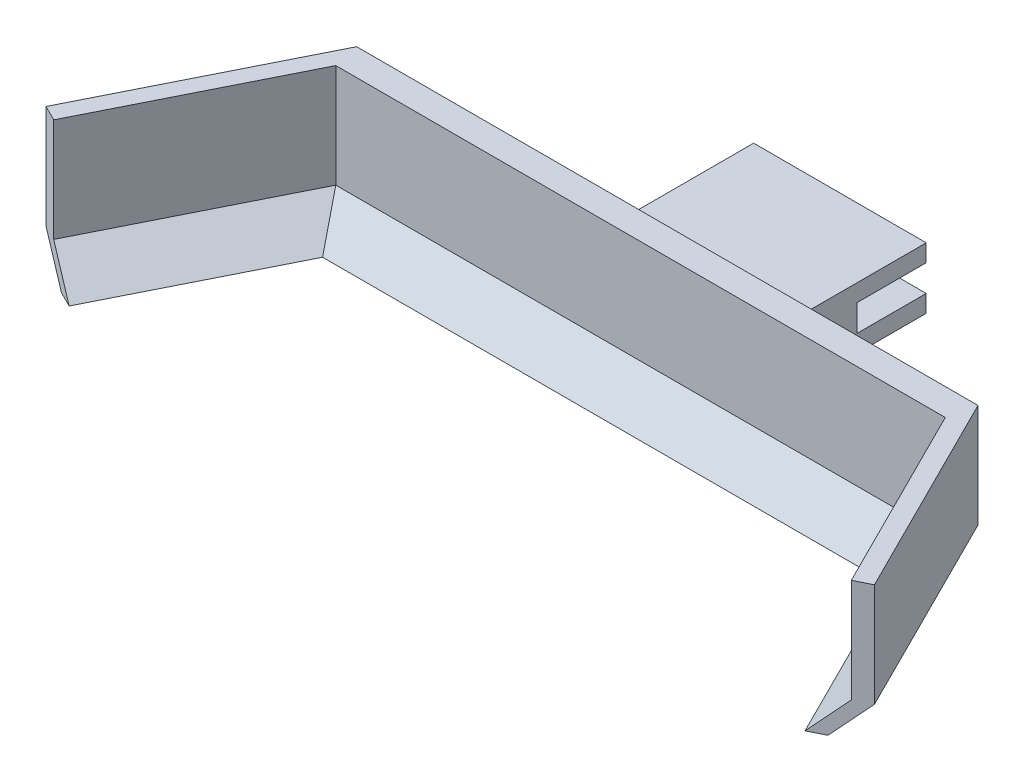
ISO-10303-21;
HEADER;
FILE_DESCRIPTION(('STEP AP214'),'2;1');
FILE_NAME('part.step','',(''),(''),'','','');
FILE_SCHEMA(('AUTOMOTIVE_DESIGN { 1 0 10303 214 1 1 1 1 }'));
ENDSEC;
DATA;
#1=APPLICATION_CONTEXT('core data for automotive mechanical design processes');
#2=APPLICATION_PROTOCOL_DEFINITION('international standard','automotive_design',2000,#1);
#3=PRODUCT_CONTEXT('',#1,'mechanical');
#4=PRODUCT('Part','Part','',(#3));
#5=PRODUCT_RELATED_PRODUCT_CATEGORY('part','',(#4));
#6=PRODUCT_DEFINITION_FORMATION('','',#4);
#7=PRODUCT_DEFINITION_CONTEXT('part definition',#1,'design');
#8=PRODUCT_DEFINITION('design','',#6,#7);
#9=PRODUCT_DEFINITION_SHAPE('','',#8);
#10=(LENGTH_UNIT() NAMED_UNIT(*) SI_UNIT(.MILLI.,.METRE.));
#11=(NAMED_UNIT(*) PLANE_ANGLE_UNIT() SI_UNIT($,.RADIAN.));
#12=(NAMED_UNIT(*) SI_UNIT($,.STERADIAN.) SOLID_ANGLE_UNIT());
#13=UNCERTAINTY_MEASURE_WITH_UNIT(LENGTH_MEASURE(1.E-05),#10,'distance_accuracy_value','');
#14=(GEOMETRIC_REPRESENTATION_CONTEXT(3) GLOBAL_UNCERTAINTY_ASSIGNED_CONTEXT((#13)) GLOBAL_UNIT_ASSIGNED_CONTEXT((#10,
#11,#12)) REPRESENTATION_CONTEXT('',''));
#15=CARTESIAN_POINT('',(0.,0.,0.));
#16=DIRECTION('',(0.,0.,1.));
#17=DIRECTION('',(1.,0.,0.));
#18=AXIS2_PLACEMENT_3D('',#15,#16,#17);
#19=CARTESIAN_POINT('',(0.,0.,-55.));
#20=DIRECTION('',(0.,0.,1.));
#21=DIRECTION('',(1.,0.,0.));
#22=AXIS2_PLACEMENT_3D('',#19,#20,#21);
#23=PLANE('',#22);
#24=DIRECTION('',(0.,-1.,0.));
#25=VECTOR('',#24,1.);
#26=CARTESIAN_POINT('',(25.,5.6,-55.));
#27=LINE('',#26,#25);
#28=CARTESIAN_POINT('',(25.,23.3,-55.));
#29=VERTEX_POINT('',#28);
#30=CARTESIAN_POINT('',(25.,18.3,-55.));
#31=VERTEX_POINT('',#30);
#32=EDGE_CURVE('E238',#29,#31,#27,.T.);
#33=ORIENTED_EDGE('',*,*,#32,.T.);
#34=DIRECTION('',(1.,0.,0.));
#35=VECTOR('',#34,1.);
#36=CARTESIAN_POINT('',(25.,18.3,-55.));
#37=LINE('',#36,#35);
#38=CARTESIAN_POINT('',(-25.,18.3,-55.));
#39=VERTEX_POINT('',#38);
#40=EDGE_CURVE('E216',#39,#31,#37,.T.);
#41=ORIENTED_EDGE('',*,*,#40,.F.);
#42=DIRECTION('',(0.,1.,0.));
#43=VECTOR('',#42,1.);
#44=CARTESIAN_POINT('',(-25.,5.6,-55.));
#45=LINE('',#44,#43);
#46=CARTESIAN_POINT('',(-25.,23.3,-55.));
#47=VERTEX_POINT('',#46);
#48=EDGE_CURVE('E235',#39,#47,#45,.T.);
#49=ORIENTED_EDGE('',*,*,#48,.T.);
#50=DIRECTION('',(1.,0.,0.));
#51=VECTOR('',#50,1.);
#52=CARTESIAN_POINT('',(25.,23.3,-55.));
#53=LINE('',#52,#51);
#54=EDGE_CURVE('E234',#47,#29,#53,.T.);
#55=ORIENTED_EDGE('',*,*,#54,.T.);
#56=EDGE_LOOP('',(#33,#41,#49,#55));
#57=FACE_BOUND('',#56,.T.);
#58=ADVANCED_FACE('F47',(#57),#23,.F.);
#59=CARTESIAN_POINT('',(-90.,10.,-5.));
#60=DIRECTION('',(0.,0.,1.));
#61=DIRECTION('',(1.,0.,0.));
#62=AXIS2_PLACEMENT_3D('',#59,#60,#61);
#63=PLANE('',#62);
#64=DIRECTION('',(0.,-1.,0.));
#65=VECTOR('',#64,1.);
#66=CARTESIAN_POINT('',(90.,10.,-5.));
#67=LINE('',#66,#65);
#68=CARTESIAN_POINT('',(90.,40.,-5.));
#69=VERTEX_POINT('',#68);
#70=CARTESIAN_POINT('',(90.,9.99999999999998,-5.));
#71=VERTEX_POINT('',#70);
#72=EDGE_CURVE('E339',#69,#71,#67,.T.);
#73=ORIENTED_EDGE('',*,*,#72,.T.);
#74=DIRECTION('',(-1.,0.,0.));
#75=VECTOR('',#74,1.);
#76=CARTESIAN_POINT('',(-90.,9.99999999999998,-5.));
#77=LINE('',#76,#75);
#78=CARTESIAN_POINT('',(25.,9.99999999999998,-5.));
#79=VERTEX_POINT('',#78);
#80=EDGE_CURVE('E393',#71,#79,#77,.T.);
#81=ORIENTED_EDGE('',*,*,#80,.T.);
#82=DIRECTION('',(0.,-1.,0.));
#83=VECTOR('',#82,1.);
#84=CARTESIAN_POINT('',(25.,5.6,-5.));
#85=LINE('',#84,#83);
#86=CARTESIAN_POINT('',(25.,23.3,-5.));
#87=VERTEX_POINT('',#86);
#88=EDGE_CURVE('E253',#87,#79,#85,.T.);
#89=ORIENTED_EDGE('',*,*,#88,.F.);
#90=DIRECTION('',(1.,0.,0.));
#91=VECTOR('',#90,1.);
#92=CARTESIAN_POINT('',(25.,23.3,-5.));
#93=LINE('',#92,#91);
#94=CARTESIAN_POINT('',(-25.,23.3,-5.));
#95=VERTEX_POINT('',#94);
#96=EDGE_CURVE('E248',#95,#87,#93,.T.);
#97=ORIENTED_EDGE('',*,*,#96,.F.);
#98=DIRECTION('',(0.,1.,0.));
#99=VECTOR('',#98,1.);
#100=CARTESIAN_POINT('',(-25.,5.6,-5.));
#101=LINE('',#100,#99);
#102=CARTESIAN_POINT('',(-25.,9.99999999999998,-5.));
#103=VERTEX_POINT('',#102);
#104=EDGE_CURVE('E245',#103,#95,#101,.T.);
#105=ORIENTED_EDGE('',*,*,#104,.F.);
#106=DIRECTION('',(-1.,0.,0.));
#107=VECTOR('',#106,1.);
#108=CARTESIAN_POINT('',(-90.,9.99999999999998,-5.));
#109=LINE('',#108,#107);
#110=CARTESIAN_POINT('',(-90.,9.99999999999998,-5.));
#111=VERTEX_POINT('',#110);
#112=EDGE_CURVE('E390',#103,#111,#109,.T.);
#113=ORIENTED_EDGE('',*,*,#112,.T.);
#114=DIRECTION('',(0.,-1.,0.));
#115=VECTOR('',#114,1.);
#116=CARTESIAN_POINT('',(-90.,10.,-5.));
#117=LINE('',#116,#115);
#118=CARTESIAN_POINT('',(-90.,40.,-5.));
#119=VERTEX_POINT('',#118);
#120=EDGE_CURVE('E328',#119,#111,#117,.T.);
#121=ORIENTED_EDGE('',*,*,#120,.F.);
#122=DIRECTION('',(-1.,0.,0.));
#123=VECTOR('',#122,1.);
#124=CARTESIAN_POINT('',(-90.,40.,-5.));
#125=LINE('',#124,#123);
#126=EDGE_CURVE('E290',#69,#119,#125,.T.);
#127=ORIENTED_EDGE('',*,*,#126,.F.);
#128=EDGE_LOOP('',(#73,#81,#89,#97,#105,#113,#121,#127));
#129=FACE_BOUND('',#128,.T.);
#130=ADVANCED_FACE('F451',(#129),#63,.F.);
#131=CARTESIAN_POINT('',(-90.,10.,-5.));
#132=DIRECTION('',(0.894427190999916,0.,0.447213595499958));
#133=DIRECTION('',(0.447213595499958,0.,-0.894427190999916));
#134=AXIS2_PLACEMENT_3D('',#131,#132,#133);
#135=PLANE('',#134);
#136=ORIENTED_EDGE('',*,*,#120,.T.);
#137=DIRECTION('',(-0.447213595499958,0.,0.894427190999916));
#138=VECTOR('',#137,1.);
#139=CARTESIAN_POINT('',(-90.,9.99999999999998,-5.));
#140=LINE('',#139,#138);
#141=CARTESIAN_POINT('',(-120.,9.99999999999998,55.));
#142=VERTEX_POINT('',#141);
#143=EDGE_CURVE('E396',#111,#142,#140,.T.);
#144=ORIENTED_EDGE('',*,*,#143,.T.);
#145=DIRECTION('',(0.,-1.,0.));
#146=VECTOR('',#145,1.);
#147=CARTESIAN_POINT('',(-120.,10.,55.));
#148=LINE('',#147,#146);
#149=CARTESIAN_POINT('',(-120.,40.,55.));
#150=VERTEX_POINT('',#149);
#151=EDGE_CURVE('E348',#150,#142,#148,.T.);
#152=ORIENTED_EDGE('',*,*,#151,.F.);
#153=DIRECTION('',(-0.447213595499958,0.,0.894427190999916));
#154=VECTOR('',#153,1.);
#155=CARTESIAN_POINT('',(-120.,40.,55.));
#156=LINE('',#155,#154);
#157=EDGE_CURVE('E294',#119,#150,#156,.T.);
#158=ORIENTED_EDGE('',*,*,#157,.F.);
#159=EDGE_LOOP('',(#136,#144,#152,#158));
#160=FACE_BOUND('',#159,.T.);
#161=ADVANCED_FACE('F465',(#160),#135,.F.);
#162=CARTESIAN_POINT('',(-120.,10.,55.));
#163=DIRECTION('',(0.447213595499958,0.,-0.894427190999916));
#164=DIRECTION('',(-0.894427190999916,0.,-0.447213595499958));
#165=AXIS2_PLACEMENT_3D('',#162,#163,#164);
#166=PLANE('',#165);
#167=ORIENTED_EDGE('',*,*,#151,.T.);
#168=DIRECTION('',(-0.632455532033678,0.707106781186545,-0.316227766016839));
#169=VECTOR('',#168,1.);
#170=CARTESIAN_POINT('',(-120.,9.99999999999998,55.));
#171=LINE('',#170,#169);
#172=CARTESIAN_POINT('',(-111.055728090001,0.,59.4721359549996));
#173=VERTEX_POINT('',#172);
#174=EDGE_CURVE('E399',#142,#173,#171,.F.);
#175=ORIENTED_EDGE('',*,*,#174,.T.);
#176=DIRECTION('',(0.894427190999916,0.,0.447213595499958));
#177=VECTOR('',#176,1.);
#178=CARTESIAN_POINT('',(-120.,0.,55.));
#179=LINE('',#178,#177);
#180=CARTESIAN_POINT('',(-106.583592135001,0.,61.7082039324994));
#181=VERTEX_POINT('',#180);
#182=EDGE_CURVE('E314',#173,#181,#179,.T.);
#183=ORIENTED_EDGE('',*,*,#182,.T.);
#184=DIRECTION('',(-0.632455532033677,0.707106781186546,-0.316227766016839));
#185=VECTOR('',#184,1.);
#186=CARTESIAN_POINT('',(-115.527864045,10.,57.2360679774998));
#187=LINE('',#186,#185);
#188=CARTESIAN_POINT('',(-115.527864045,10.,57.2360679774998));
#189=VERTEX_POINT('',#188);
#190=EDGE_CURVE('E353',#189,#181,#187,.F.);
#191=ORIENTED_EDGE('',*,*,#190,.F.);
#192=DIRECTION('',(0.,-1.,0.));
#193=VECTOR('',#192,1.);
#194=CARTESIAN_POINT('',(-115.527864045,40.,57.2360679774998));
#195=LINE('',#194,#193);
#196=CARTESIAN_POINT('',(-115.527864045,40.,57.2360679774998));
#197=VERTEX_POINT('',#196);
#198=EDGE_CURVE('E310',#197,#189,#195,.T.);
#199=ORIENTED_EDGE('',*,*,#198,.F.);
#200=DIRECTION('',(0.894427190999916,0.,0.447213595499958));
#201=VECTOR('',#200,1.);
#202=CARTESIAN_POINT('',(-115.527864045,40.,57.2360679774998));
#203=LINE('',#202,#201);
#204=EDGE_CURVE('E269',#150,#197,#203,.T.);
#205=ORIENTED_EDGE('',*,*,#204,.F.);
#206=EDGE_LOOP('',(#167,#175,#183,#191,#199,#205));
#207=FACE_BOUND('',#206,.T.);
#208=ADVANCED_FACE('F469',(#207),#166,.F.);
#209=CARTESIAN_POINT('',(-88.2917960675006,10.,2.76393202250021));
#210=DIRECTION('',(0.632455532033675,0.707106781186549,0.316227766016837));
#211=DIRECTION('',(-0.745355992499931,0.666666666666665,0.));
#212=AXIS2_PLACEMENT_3D('',#209,#210,#211);
#213=PLANE('',#212);
#214=DIRECTION('',(-0.447213595499958,0.,0.894427190999916));
#215=VECTOR('',#214,1.);
#216=CARTESIAN_POINT('',(-79.3475241575014,0.,7.2360679774998));
#217=LINE('',#216,#215);
#218=CARTESIAN_POINT('',(-82.1114561800016,0.,12.7639320225002));
#219=VERTEX_POINT('',#218);
#220=EDGE_CURVE('E331',#181,#219,#217,.F.);
#221=ORIENTED_EDGE('',*,*,#220,.T.);
#222=DIRECTION('',(0.400446571456079,-0.647936163294297,0.647936163294299));
#223=VECTOR('',#222,1.);
#224=CARTESIAN_POINT('',(-88.2917960675006,10.,2.76393202250021));
#225=LINE('',#224,#223);
#226=CARTESIAN_POINT('',(-88.2917960675006,10.,2.76393202250021));
#227=VERTEX_POINT('',#226);
#228=EDGE_CURVE('E358',#227,#219,#225,.T.);
#229=ORIENTED_EDGE('',*,*,#228,.F.);
#230=DIRECTION('',(0.447213595499958,0.,-0.894427190999916));
#231=VECTOR('',#230,1.);
#232=CARTESIAN_POINT('',(-88.2917960675006,10.,2.76393202250021));
#233=LINE('',#232,#231);
#234=EDGE_CURVE('E315',#189,#227,#233,.T.);
#235=ORIENTED_EDGE('',*,*,#234,.F.);
#236=ORIENTED_EDGE('',*,*,#190,.T.);
#237=EDGE_LOOP('',(#221,#229,#235,#236));
#238=FACE_BOUND('',#237,.T.);
#239=ADVANCED_FACE('F480',(#238),#213,.T.);
#240=CARTESIAN_POINT('',(-88.2917960675006,10.,2.76393202250021));
#241=DIRECTION('',(0.,0.707106781186549,0.707106781186546));
#242=DIRECTION('',(0.,-0.707106781186546,0.707106781186549));
#243=AXIS2_PLACEMENT_3D('',#240,#241,#242);
#244=PLANE('',#243);
#245=DIRECTION('',(-1.,0.,0.));
#246=VECTOR('',#245,1.);
#247=CARTESIAN_POINT('',(-88.2917960675006,0.,12.7639320225002));
#248=LINE('',#247,#246);
#249=CARTESIAN_POINT('',(82.1114561800017,0.,12.7639320225002));
#250=VERTEX_POINT('',#249);
#251=EDGE_CURVE('E364',#219,#250,#248,.F.);
#252=ORIENTED_EDGE('',*,*,#251,.T.);
#253=DIRECTION('',(-0.400446571456079,-0.647936163294297,0.647936163294299));
#254=VECTOR('',#253,1.);
#255=CARTESIAN_POINT('',(59.9753003570419,-35.8170525018126,48.580984524313));
#256=LINE('',#255,#254);
#257=CARTESIAN_POINT('',(88.2917960675006,10.,2.76393202250021));
#258=VERTEX_POINT('',#257);
#259=EDGE_CURVE('E354',#258,#250,#256,.T.);
#260=ORIENTED_EDGE('',*,*,#259,.F.);
#261=DIRECTION('',(1.,0.,0.));
#262=VECTOR('',#261,1.);
#263=CARTESIAN_POINT('',(-88.2917960675006,10.,2.76393202250021));
#264=LINE('',#263,#262);
#265=EDGE_CURVE('E319',#227,#258,#264,.T.);
#266=ORIENTED_EDGE('',*,*,#265,.F.);
#267=ORIENTED_EDGE('',*,*,#228,.T.);
#268=EDGE_LOOP('',(#252,#260,#266,#267));
#269=FACE_BOUND('',#268,.T.);
#270=ADVANCED_FACE('F503',(#269),#244,.T.);
#271=CARTESIAN_POINT('',(88.2917960675006,10.,2.76393202250021));
#272=DIRECTION('',(-0.632455532033675,0.707106781186549,0.316227766016837));
#273=DIRECTION('',(-0.745355992499931,-0.666666666666665,0.));
#274=AXIS2_PLACEMENT_3D('',#271,#272,#273);
#275=PLANE('',#274);
#276=DIRECTION('',(-0.447213595499958,0.,-0.894427190999916));
#277=VECTOR('',#276,1.);
#278=CARTESIAN_POINT('',(79.3475241575014,0.,7.2360679774998));
#279=LINE('',#278,#277);
#280=CARTESIAN_POINT('',(106.583592135001,0.,61.7082039324994));
#281=VERTEX_POINT('',#280);
#282=EDGE_CURVE('E335',#250,#281,#279,.F.);
#283=ORIENTED_EDGE('',*,*,#282,.T.);
#284=DIRECTION('',(0.632455532033677,0.707106781186546,-0.316227766016838));
#285=VECTOR('',#284,1.);
#286=CARTESIAN_POINT('',(115.527864045,10.,57.2360679774998));
#287=LINE('',#286,#285);
#288=CARTESIAN_POINT('',(115.527864045,10.,57.2360679774998));
#289=VERTEX_POINT('',#288);
#290=EDGE_CURVE('E347',#289,#281,#287,.F.);
#291=ORIENTED_EDGE('',*,*,#290,.F.);
#292=DIRECTION('',(0.447213595499958,0.,0.894427190999916));
#293=VECTOR('',#292,1.);
#294=CARTESIAN_POINT('',(88.2917960675006,10.,2.76393202250021));
#295=LINE('',#294,#293);
#296=EDGE_CURVE('E324',#258,#289,#295,.T.);
#297=ORIENTED_EDGE('',*,*,#296,.F.);
#298=ORIENTED_EDGE('',*,*,#259,.T.);
#299=EDGE_LOOP('',(#283,#291,#297,#298));
#300=FACE_BOUND('',#299,.T.);
#301=ADVANCED_FACE('F501',(#300),#275,.T.);
#302=CARTESIAN_POINT('',(115.527864045,10.,57.2360679774998));
#303=DIRECTION('',(-0.447213595499957,0.,-0.894427190999917));
#304=DIRECTION('',(-0.894427190999917,0.,0.447213595499957));
#305=AXIS2_PLACEMENT_3D('',#302,#303,#304);
#306=PLANE('',#305);
#307=DIRECTION('',(0.894427190999916,0.,-0.447213595499957));
#308=VECTOR('',#307,1.);
#309=CARTESIAN_POINT('',(115.527864045,0.,57.2360679774998));
#310=LINE('',#309,#308);
#311=CARTESIAN_POINT('',(111.055728090001,0.,59.4721359549996));
#312=VERTEX_POINT('',#311);
#313=EDGE_CURVE('E320',#281,#312,#310,.T.);
#314=ORIENTED_EDGE('',*,*,#313,.T.);
#315=DIRECTION('',(-0.632455532033678,-0.707106781186546,0.316227766016838));
#316=VECTOR('',#315,1.);
#317=CARTESIAN_POINT('',(120.,9.99999999999994,55.));
#318=LINE('',#317,#316);
#319=CARTESIAN_POINT('',(120.,9.99999999999998,55.));
#320=VERTEX_POINT('',#319);
#321=EDGE_CURVE('E387',#312,#320,#318,.F.);
#322=ORIENTED_EDGE('',*,*,#321,.T.);
#323=DIRECTION('',(0.,-1.,0.));
#324=VECTOR('',#323,1.);
#325=CARTESIAN_POINT('',(120.,10.,55.));
#326=LINE('',#325,#324);
#327=CARTESIAN_POINT('',(120.,40.,55.));
#328=VERTEX_POINT('',#327);
#329=EDGE_CURVE('E343',#328,#320,#326,.T.);
#330=ORIENTED_EDGE('',*,*,#329,.F.);
#331=DIRECTION('',(0.894427190999916,0.,-0.447213595499957));
#332=VECTOR('',#331,1.);
#333=CARTESIAN_POINT('',(120.,40.,55.));
#334=LINE('',#333,#332);
#335=CARTESIAN_POINT('',(115.527864045,40.,57.2360679774998));
#336=VERTEX_POINT('',#335);
#337=EDGE_CURVE('E282',#336,#328,#334,.T.);
#338=ORIENTED_EDGE('',*,*,#337,.F.);
#339=DIRECTION('',(0.,-1.,0.));
#340=VECTOR('',#339,1.);
#341=CARTESIAN_POINT('',(115.527864045,40.,57.2360679774998));
#342=LINE('',#341,#340);
#343=EDGE_CURVE('E298',#336,#289,#342,.T.);
#344=ORIENTED_EDGE('',*,*,#343,.T.);
#345=ORIENTED_EDGE('',*,*,#290,.T.);
#346=EDGE_LOOP('',(#314,#322,#330,#338,#344,#345));
#347=FACE_BOUND('',#346,.T.);
#348=ADVANCED_FACE('F496',(#347),#306,.F.);
#349=CARTESIAN_POINT('',(90.,10.,-5.));
#350=DIRECTION('',(-0.894427190999916,0.,0.447213595499958));
#351=DIRECTION('',(0.447213595499958,0.,0.894427190999916));
#352=AXIS2_PLACEMENT_3D('',#349,#350,#351);
#353=PLANE('',#352);
#354=ORIENTED_EDGE('',*,*,#329,.T.);
#355=DIRECTION('',(-0.447213595499958,0.,-0.894427190999916));
#356=VECTOR('',#355,1.);
#357=CARTESIAN_POINT('',(90.,9.99999999999998,-5.));
#358=LINE('',#357,#356);
#359=EDGE_CURVE('E352',#320,#71,#358,.T.);
#360=ORIENTED_EDGE('',*,*,#359,.T.);
#361=ORIENTED_EDGE('',*,*,#72,.F.);
#362=DIRECTION('',(-0.447213595499958,0.,-0.894427190999916));
#363=VECTOR('',#362,1.);
#364=CARTESIAN_POINT('',(90.,40.,-5.));
#365=LINE('',#364,#363);
#366=EDGE_CURVE('E286',#328,#69,#365,.T.);
#367=ORIENTED_EDGE('',*,*,#366,.F.);
#368=EDGE_LOOP('',(#354,#360,#361,#367));
#369=FACE_BOUND('',#368,.T.);
#370=ADVANCED_FACE('F456',(#369),#353,.F.);
#371=CARTESIAN_POINT('',(0.,0.,0.));
#372=DIRECTION('',(0.,1.,0.));
#373=DIRECTION('',(0.,0.,1.));
#374=AXIS2_PLACEMENT_3D('',#371,#372,#373);
#375=PLANE('',#374);
#376=DIRECTION('',(1.,0.,0.));
#377=VECTOR('',#376,1.);
#378=CARTESIAN_POINT('',(0.,0.,5.00000000000004));
#379=LINE('',#378,#377);
#380=CARTESIAN_POINT('',(-83.819660112501,0.,5.00000000000004));
#381=VERTEX_POINT('',#380);
#382=CARTESIAN_POINT('',(83.8196601125011,0.,5.00000000000004));
#383=VERTEX_POINT('',#382);
#384=EDGE_CURVE('E381',#381,#383,#379,.T.);
#385=ORIENTED_EDGE('',*,*,#384,.T.);
#386=DIRECTION('',(0.447213595499958,0.,0.894427190999916));
#387=VECTOR('',#386,1.);
#388=CARTESIAN_POINT('',(65.0557280900008,0.,-32.5278640450004));
#389=LINE('',#388,#387);
#390=EDGE_CURVE('E384',#383,#312,#389,.T.);
#391=ORIENTED_EDGE('',*,*,#390,.T.);
#392=ORIENTED_EDGE('',*,*,#313,.F.);
#393=ORIENTED_EDGE('',*,*,#282,.F.);
#394=ORIENTED_EDGE('',*,*,#251,.F.);
#395=ORIENTED_EDGE('',*,*,#220,.F.);
#396=ORIENTED_EDGE('',*,*,#182,.F.);
#397=DIRECTION('',(0.447213595499958,0.,-0.894427190999916));
#398=VECTOR('',#397,1.);
#399=CARTESIAN_POINT('',(-65.0557280900008,0.,-32.5278640450004));
#400=LINE('',#399,#398);
#401=EDGE_CURVE('E378',#173,#381,#400,.T.);
#402=ORIENTED_EDGE('',*,*,#401,.T.);
#403=EDGE_LOOP('',(#385,#391,#392,#393,#394,#395,#396,#402));
#404=FACE_BOUND('',#403,.T.);
#405=ADVANCED_FACE('F475',(#404),#375,.F.);
#406=CARTESIAN_POINT('',(-88.2917960675006,40.,2.76393202250021));
#407=DIRECTION('',(-0.894427190999916,0.,-0.447213595499958));
#408=DIRECTION('',(-0.447213595499958,0.,0.894427190999916));
#409=AXIS2_PLACEMENT_3D('',#406,#407,#408);
#410=PLANE('',#409);
#411=ORIENTED_EDGE('',*,*,#234,.T.);
#412=DIRECTION('',(0.,-1.,0.));
#413=VECTOR('',#412,1.);
#414=CARTESIAN_POINT('',(-88.2917960675006,40.,2.76393202250021));
#415=LINE('',#414,#413);
#416=CARTESIAN_POINT('',(-88.2917960675006,40.,2.76393202250021));
#417=VERTEX_POINT('',#416);
#418=EDGE_CURVE('E306',#417,#227,#415,.T.);
#419=ORIENTED_EDGE('',*,*,#418,.F.);
#420=DIRECTION('',(0.447213595499958,0.,-0.894427190999916));
#421=VECTOR('',#420,1.);
#422=CARTESIAN_POINT('',(-88.2917960675006,40.,2.76393202250021));
#423=LINE('',#422,#421);
#424=EDGE_CURVE('E273',#197,#417,#423,.T.);
#425=ORIENTED_EDGE('',*,*,#424,.F.);
#426=ORIENTED_EDGE('',*,*,#198,.T.);
#427=EDGE_LOOP('',(#411,#419,#425,#426));
#428=FACE_BOUND('',#427,.T.);
#429=ADVANCED_FACE('F484',(#428),#410,.F.);
#430=CARTESIAN_POINT('',(88.2917960675006,40.,2.76393202250021));
#431=DIRECTION('',(0.,0.,-1.));
#432=DIRECTION('',(-1.,0.,0.));
#433=AXIS2_PLACEMENT_3D('',#430,#431,#432);
#434=PLANE('',#433);
#435=ORIENTED_EDGE('',*,*,#265,.T.);
#436=DIRECTION('',(0.,-1.,0.));
#437=VECTOR('',#436,1.);
#438=CARTESIAN_POINT('',(88.2917960675006,40.,2.76393202250021));
#439=LINE('',#438,#437);
#440=CARTESIAN_POINT('',(88.2917960675006,40.,2.76393202250021));
#441=VERTEX_POINT('',#440);
#442=EDGE_CURVE('E302',#441,#258,#439,.T.);
#443=ORIENTED_EDGE('',*,*,#442,.F.);
#444=DIRECTION('',(1.,0.,0.));
#445=VECTOR('',#444,1.);
#446=CARTESIAN_POINT('',(88.2917960675006,40.,2.76393202250021));
#447=LINE('',#446,#445);
#448=EDGE_CURVE('E276',#417,#441,#447,.T.);
#449=ORIENTED_EDGE('',*,*,#448,.F.);
#450=ORIENTED_EDGE('',*,*,#418,.T.);
#451=EDGE_LOOP('',(#435,#443,#449,#450));
#452=FACE_BOUND('',#451,.T.);
#453=ADVANCED_FACE('F490',(#452),#434,.F.);
#454=CARTESIAN_POINT('',(115.527864045,40.,57.2360679774998));
#455=DIRECTION('',(0.894427190999916,0.,-0.447213595499958));
#456=DIRECTION('',(-0.447213595499958,0.,-0.894427190999916));
#457=AXIS2_PLACEMENT_3D('',#454,#455,#456);
#458=PLANE('',#457);
#459=ORIENTED_EDGE('',*,*,#296,.T.);
#460=ORIENTED_EDGE('',*,*,#343,.F.);
#461=DIRECTION('',(0.447213595499958,0.,0.894427190999916));
#462=VECTOR('',#461,1.);
#463=CARTESIAN_POINT('',(115.527864045,40.,57.2360679774998));
#464=LINE('',#463,#462);
#465=EDGE_CURVE('E279',#441,#336,#464,.T.);
#466=ORIENTED_EDGE('',*,*,#465,.F.);
#467=ORIENTED_EDGE('',*,*,#442,.T.);
#468=EDGE_LOOP('',(#459,#460,#466,#467));
#469=FACE_BOUND('',#468,.T.);
#470=ADVANCED_FACE('F492',(#469),#458,.F.);
#471=CARTESIAN_POINT('',(0.,40.,0.));
#472=DIRECTION('',(0.,-1.,0.));
#473=DIRECTION('',(0.,0.,-1.));
#474=AXIS2_PLACEMENT_3D('',#471,#472,#473);
#475=PLANE('',#474);
#476=ORIENTED_EDGE('',*,*,#204,.T.);
#477=ORIENTED_EDGE('',*,*,#424,.T.);
#478=ORIENTED_EDGE('',*,*,#448,.T.);
#479=ORIENTED_EDGE('',*,*,#465,.T.);
#480=ORIENTED_EDGE('',*,*,#337,.T.);
#481=ORIENTED_EDGE('',*,*,#366,.T.);
#482=ORIENTED_EDGE('',*,*,#126,.T.);
#483=ORIENTED_EDGE('',*,*,#157,.T.);
#484=EDGE_LOOP('',(#476,#477,#478,#479,#480,#481,#482,#483));
#485=FACE_BOUND('',#484,.T.);
#486=ADVANCED_FACE('F462',(#485),#475,.F.);
#487=CARTESIAN_POINT('',(-25.,5.6,-55.));
#488=DIRECTION('',(1.,0.,0.));
#489=DIRECTION('',(0.,0.,-1.));
#490=AXIS2_PLACEMENT_3D('',#487,#488,#489);
#491=PLANE('',#490);
#492=ORIENTED_EDGE('',*,*,#48,.F.);
#493=DIRECTION('',(0.,0.,-1.));
#494=VECTOR('',#493,1.);
#495=CARTESIAN_POINT('',(-25.,18.3,-35.));
#496=LINE('',#495,#494);
#497=CARTESIAN_POINT('',(-25.,18.3,-35.));
#498=VERTEX_POINT('',#497);
#499=EDGE_CURVE('E225',#498,#39,#496,.T.);
#500=ORIENTED_EDGE('',*,*,#499,.F.);
#501=DIRECTION('',(0.,1.,0.));
#502=VECTOR('',#501,1.);
#503=CARTESIAN_POINT('',(-25.,10.6,-35.));
#504=LINE('',#503,#502);
#505=CARTESIAN_POINT('',(-25.,10.6,-35.));
#506=VERTEX_POINT('',#505);
#507=EDGE_CURVE('E205',#506,#498,#504,.T.);
#508=ORIENTED_EDGE('',*,*,#507,.F.);
#509=DIRECTION('',(0.,0.,-1.));
#510=VECTOR('',#509,1.);
#511=CARTESIAN_POINT('',(-25.,10.6,-35.));
#512=LINE('',#511,#510);
#513=CARTESIAN_POINT('',(-25.,10.6,-55.));
#514=VERTEX_POINT('',#513);
#515=EDGE_CURVE('E201',#506,#514,#512,.T.);
#516=ORIENTED_EDGE('',*,*,#515,.T.);
#517=CARTESIAN_POINT('',(-25.,5.6,-55.));
#518=VERTEX_POINT('',#517);
#519=EDGE_CURVE('E230',#518,#514,#45,.T.);
#520=ORIENTED_EDGE('',*,*,#519,.F.);
#521=DIRECTION('',(0.,0.,1.));
#522=VECTOR('',#521,1.);
#523=CARTESIAN_POINT('',(-25.,5.6,-55.));
#524=LINE('',#523,#522);
#525=CARTESIAN_POINT('',(-25.,5.6,-0.599999999999996));
#526=VERTEX_POINT('',#525);
#527=EDGE_CURVE('E65',#518,#526,#524,.T.);
#528=ORIENTED_EDGE('',*,*,#527,.T.);
#529=DIRECTION('',(0.,-0.707106781186546,0.70710678118655));
#530=VECTOR('',#529,1.);
#531=CARTESIAN_POINT('',(-25.,32.8,-27.8000000000001));
#532=LINE('',#531,#530);
#533=EDGE_CURVE('E11',#526,#103,#532,.F.);
#534=ORIENTED_EDGE('',*,*,#533,.T.);
#535=ORIENTED_EDGE('',*,*,#104,.T.);
#536=DIRECTION('',(0.,0.,1.));
#537=VECTOR('',#536,1.);
#538=CARTESIAN_POINT('',(-25.,23.3,-55.));
#539=LINE('',#538,#537);
#540=EDGE_CURVE('E265',#47,#95,#539,.T.);
#541=ORIENTED_EDGE('',*,*,#540,.F.);
#542=EDGE_LOOP('',(#492,#500,#508,#516,#520,#528,#534,#535,#541));
#543=FACE_BOUND('',#542,.T.);
#544=ADVANCED_FACE('F437',(#543),#491,.F.);
#545=CARTESIAN_POINT('',(25.,23.3,-55.));
#546=DIRECTION('',(0.,-1.,0.));
#547=DIRECTION('',(0.,0.,-1.));
#548=AXIS2_PLACEMENT_3D('',#545,#546,#547);
#549=PLANE('',#548);
#550=ORIENTED_EDGE('',*,*,#96,.T.);
#551=DIRECTION('',(0.,0.,1.));
#552=VECTOR('',#551,1.);
#553=CARTESIAN_POINT('',(25.,23.3,-55.));
#554=LINE('',#553,#552);
#555=EDGE_CURVE('E261',#29,#87,#554,.T.);
#556=ORIENTED_EDGE('',*,*,#555,.F.);
#557=ORIENTED_EDGE('',*,*,#54,.F.);
#558=ORIENTED_EDGE('',*,*,#540,.T.);
#559=EDGE_LOOP('',(#550,#556,#557,#558));
#560=FACE_BOUND('',#559,.T.);
#561=ADVANCED_FACE('F454',(#560),#549,.F.);
#562=CARTESIAN_POINT('',(25.,5.6,-55.));
#563=DIRECTION('',(-1.,0.,0.));
#564=DIRECTION('',(0.,0.,1.));
#565=AXIS2_PLACEMENT_3D('',#562,#563,#564);
#566=PLANE('',#565);
#567=DIRECTION('',(0.,-1.,0.));
#568=VECTOR('',#567,1.);
#569=CARTESIAN_POINT('',(25.,10.6,-35.));
#570=LINE('',#569,#568);
#571=CARTESIAN_POINT('',(25.,18.3,-35.));
#572=VERTEX_POINT('',#571);
#573=CARTESIAN_POINT('',(25.,10.6,-35.));
#574=VERTEX_POINT('',#573);
#575=EDGE_CURVE('E206',#572,#574,#570,.T.);
#576=ORIENTED_EDGE('',*,*,#575,.F.);
#577=DIRECTION('',(0.,0.,-1.));
#578=VECTOR('',#577,1.);
#579=CARTESIAN_POINT('',(25.,18.3,-35.));
#580=LINE('',#579,#578);
#581=EDGE_CURVE('E249',#572,#31,#580,.T.);
#582=ORIENTED_EDGE('',*,*,#581,.T.);
#583=ORIENTED_EDGE('',*,*,#32,.F.);
#584=ORIENTED_EDGE('',*,*,#555,.T.);
#585=ORIENTED_EDGE('',*,*,#88,.T.);
#586=DIRECTION('',(0.,0.707106781186546,-0.70710678118655));
#587=VECTOR('',#586,1.);
#588=CARTESIAN_POINT('',(25.,32.8,-27.8000000000001));
#589=LINE('',#588,#587);
#590=CARTESIAN_POINT('',(25.,5.6,-0.599999999999996));
#591=VERTEX_POINT('',#590);
#592=EDGE_CURVE('E402',#79,#591,#589,.F.);
#593=ORIENTED_EDGE('',*,*,#592,.T.);
#594=DIRECTION('',(0.,0.,1.));
#595=VECTOR('',#594,1.);
#596=CARTESIAN_POINT('',(25.,5.6,-55.));
#597=LINE('',#596,#595);
#598=CARTESIAN_POINT('',(25.,5.6,-55.));
#599=VERTEX_POINT('',#598);
#600=EDGE_CURVE('E72',#599,#591,#597,.T.);
#601=ORIENTED_EDGE('',*,*,#600,.F.);
#602=CARTESIAN_POINT('',(25.,10.6,-55.));
#603=VERTEX_POINT('',#602);
#604=EDGE_CURVE('E220',#603,#599,#27,.T.);
#605=ORIENTED_EDGE('',*,*,#604,.F.);
#606=DIRECTION('',(0.,0.,-1.));
#607=VECTOR('',#606,1.);
#608=CARTESIAN_POINT('',(25.,10.6,-35.));
#609=LINE('',#608,#607);
#610=EDGE_CURVE('E198',#574,#603,#609,.T.);
#611=ORIENTED_EDGE('',*,*,#610,.F.);
#612=EDGE_LOOP('',(#576,#582,#583,#584,#585,#593,#601,#605,#611));
#613=FACE_BOUND('',#612,.T.);
#614=ADVANCED_FACE('F219',(#613),#566,.F.);
#615=CARTESIAN_POINT('',(25.,5.6,-55.));
#616=DIRECTION('',(0.,1.,0.));
#617=DIRECTION('',(0.,0.,1.));
#618=AXIS2_PLACEMENT_3D('',#615,#616,#617);
#619=PLANE('',#618);
#620=ORIENTED_EDGE('',*,*,#600,.T.);
#621=DIRECTION('',(1.,0.,0.));
#622=VECTOR('',#621,1.);
#623=CARTESIAN_POINT('',(25.,5.6,-0.599999999999996));
#624=LINE('',#623,#622);
#625=EDGE_CURVE('E58',#591,#526,#624,.F.);
#626=ORIENTED_EDGE('',*,*,#625,.T.);
#627=ORIENTED_EDGE('',*,*,#527,.F.);
#628=DIRECTION('',(-1.,0.,0.));
#629=VECTOR('',#628,1.);
#630=CARTESIAN_POINT('',(25.,5.6,-55.));
#631=LINE('',#630,#629);
#632=EDGE_CURVE('E242',#599,#518,#631,.T.);
#633=ORIENTED_EDGE('',*,*,#632,.F.);
#634=EDGE_LOOP('',(#620,#626,#627,#633));
#635=FACE_BOUND('',#634,.T.);
#636=ADVANCED_FACE('F444',(#635),#619,.F.);
#637=ORIENTED_EDGE('',*,*,#519,.T.);
#638=DIRECTION('',(-1.,0.,0.));
#639=VECTOR('',#638,1.);
#640=CARTESIAN_POINT('',(25.,10.6,-55.));
#641=LINE('',#640,#639);
#642=EDGE_CURVE('E415',#603,#514,#641,.T.);
#643=ORIENTED_EDGE('',*,*,#642,.F.);
#644=ORIENTED_EDGE('',*,*,#604,.T.);
#645=ORIENTED_EDGE('',*,*,#632,.T.);
#646=EDGE_LOOP('',(#637,#643,#644,#645));
#647=FACE_BOUND('',#646,.T.);
#648=ADVANCED_FACE('F441',(#647),#23,.F.);
#649=CARTESIAN_POINT('',(25.,18.3,-35.));
#650=DIRECTION('',(0.,1.,0.));
#651=DIRECTION('',(0.,0.,1.));
#652=AXIS2_PLACEMENT_3D('',#649,#650,#651);
#653=PLANE('',#652);
#654=ORIENTED_EDGE('',*,*,#40,.T.);
#655=ORIENTED_EDGE('',*,*,#581,.F.);
#656=DIRECTION('',(1.,0.,0.));
#657=VECTOR('',#656,1.);
#658=CARTESIAN_POINT('',(25.,18.3,-35.));
#659=LINE('',#658,#657);
#660=EDGE_CURVE('E212',#498,#572,#659,.T.);
#661=ORIENTED_EDGE('',*,*,#660,.F.);
#662=ORIENTED_EDGE('',*,*,#499,.T.);
#663=EDGE_LOOP('',(#654,#655,#661,#662));
#664=FACE_BOUND('',#663,.T.);
#665=ADVANCED_FACE('F431',(#664),#653,.F.);
#666=CARTESIAN_POINT('',(25.,10.6,-35.));
#667=DIRECTION('',(0.,-1.,0.));
#668=DIRECTION('',(0.,0.,-1.));
#669=AXIS2_PLACEMENT_3D('',#666,#667,#668);
#670=PLANE('',#669);
#671=ORIENTED_EDGE('',*,*,#642,.T.);
#672=ORIENTED_EDGE('',*,*,#515,.F.);
#673=DIRECTION('',(-1.,0.,0.));
#674=VECTOR('',#673,1.);
#675=CARTESIAN_POINT('',(25.,10.6,-35.));
#676=LINE('',#675,#674);
#677=EDGE_CURVE('E194',#574,#506,#676,.T.);
#678=ORIENTED_EDGE('',*,*,#677,.F.);
#679=ORIENTED_EDGE('',*,*,#610,.T.);
#680=EDGE_LOOP('',(#671,#672,#678,#679));
#681=FACE_BOUND('',#680,.T.);
#682=ADVANCED_FACE('F196',(#681),#670,.F.);
#683=CARTESIAN_POINT('',(0.,0.,-35.));
#684=DIRECTION('',(0.,0.,1.));
#685=DIRECTION('',(1.,0.,0.));
#686=AXIS2_PLACEMENT_3D('',#683,#684,#685);
#687=PLANE('',#686);
#688=ORIENTED_EDGE('',*,*,#575,.T.);
#689=ORIENTED_EDGE('',*,*,#677,.T.);
#690=ORIENTED_EDGE('',*,*,#507,.T.);
#691=ORIENTED_EDGE('',*,*,#660,.T.);
#692=EDGE_LOOP('',(#688,#689,#690,#691));
#693=FACE_BOUND('',#692,.T.);
#694=ADVANCED_FACE('F210',(#693),#687,.F.);
#695=CARTESIAN_POINT('',(-90.,9.99999999999998,-5.));
#696=DIRECTION('',(0.632455532033674,0.70710678118655,0.316227766016837));
#697=DIRECTION('',(-0.447213595499958,0.,0.894427190999916));
#698=AXIS2_PLACEMENT_3D('',#695,#696,#697);
#699=PLANE('',#698);
#700=ORIENTED_EDGE('',*,*,#174,.F.);
#701=ORIENTED_EDGE('',*,*,#143,.F.);
#702=DIRECTION('',(0.40044657145608,-0.647936163294296,0.6479361632943));
#703=VECTOR('',#702,1.);
#704=CARTESIAN_POINT('',(-90.,9.99999999999998,-5.));
#705=LINE('',#704,#703);
#706=EDGE_CURVE('E52',#381,#111,#705,.F.);
#707=ORIENTED_EDGE('',*,*,#706,.F.);
#708=ORIENTED_EDGE('',*,*,#401,.F.);
#709=EDGE_LOOP('',(#700,#701,#707,#708));
#710=FACE_BOUND('',#709,.T.);
#711=ADVANCED_FACE('F50',(#710),#699,.F.);
#712=CARTESIAN_POINT('',(-90.,9.99999999999998,-5.));
#713=DIRECTION('',(0.,0.707106781186549,0.707106781186545));
#714=DIRECTION('',(-1.,0.,0.));
#715=AXIS2_PLACEMENT_3D('',#712,#713,#714);
#716=PLANE('',#715);
#717=ORIENTED_EDGE('',*,*,#592,.F.);
#718=ORIENTED_EDGE('',*,*,#80,.F.);
#719=DIRECTION('',(-0.400446571456079,-0.647936163294296,0.6479361632943));
#720=VECTOR('',#719,1.);
#721=CARTESIAN_POINT('',(61.1356578136329,-36.7034867204493,41.7034867204496));
#722=LINE('',#721,#720);
#723=EDGE_CURVE('E406',#383,#71,#722,.F.);
#724=ORIENTED_EDGE('',*,*,#723,.F.);
#725=ORIENTED_EDGE('',*,*,#384,.F.);
#726=ORIENTED_EDGE('',*,*,#706,.T.);
#727=ORIENTED_EDGE('',*,*,#112,.F.);
#728=ORIENTED_EDGE('',*,*,#533,.F.);
#729=ORIENTED_EDGE('',*,*,#625,.F.);
#730=EDGE_LOOP('',(#717,#718,#724,#725,#726,#727,#728,#729));
#731=FACE_BOUND('',#730,.T.);
#732=ADVANCED_FACE('F447',(#731),#716,.F.);
#733=CARTESIAN_POINT('',(90.,9.99999999999998,-5.));
#734=DIRECTION('',(-0.632455532033674,0.707106781186549,0.316227766016837));
#735=DIRECTION('',(-0.447213595499958,0.,-0.894427190999916));
#736=AXIS2_PLACEMENT_3D('',#733,#734,#735);
#737=PLANE('',#736);
#738=ORIENTED_EDGE('',*,*,#321,.F.);
#739=ORIENTED_EDGE('',*,*,#390,.F.);
#740=ORIENTED_EDGE('',*,*,#723,.T.);
#741=ORIENTED_EDGE('',*,*,#359,.F.);
#742=EDGE_LOOP('',(#738,#739,#740,#741));
#743=FACE_BOUND('',#742,.T.);
#744=ADVANCED_FACE('F498',(#743),#737,.F.);
#745=CLOSED_SHELL('',(#58,#130,#161,#208,#239,#270,#301,#348,#370,#405,#429,#453,#470,#486,#544,
#561,#614,#636,#648,#665,#682,#694,#711,#732,#744));
#746=MANIFOLD_SOLID_BREP('B2',#745);
#747=ADVANCED_BREP_SHAPE_REPRESENTATION('',(#18,#746),#14);
#748=SHAPE_DEFINITION_REPRESENTATION(#9,#747);
ENDSEC;
END-ISO-10303-21;
